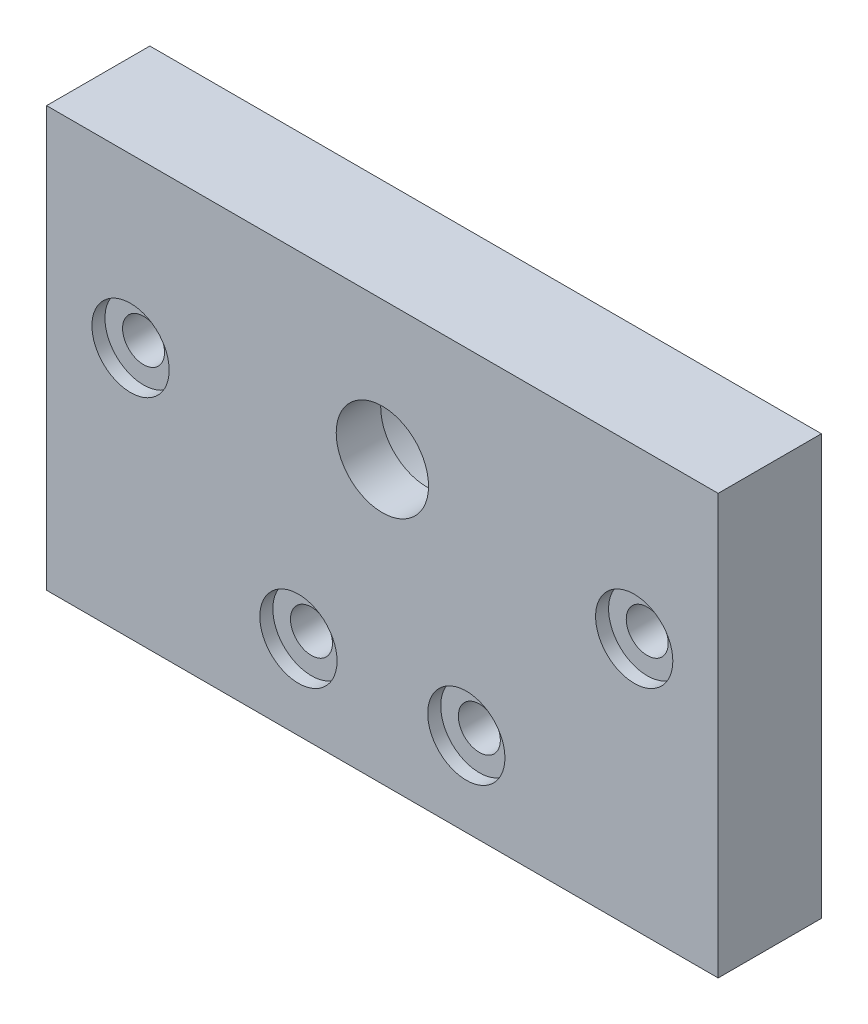
ISO-10303-21;
HEADER;
FILE_DESCRIPTION(('STEP AP214'),'2;1');
FILE_NAME('part.step','',(''),(''),'','','');
FILE_SCHEMA(('AUTOMOTIVE_DESIGN { 1 0 10303 214 1 1 1 1 }'));
ENDSEC;
DATA;
#1=APPLICATION_CONTEXT('core data for automotive mechanical design processes');
#2=APPLICATION_PROTOCOL_DEFINITION('international standard','automotive_design',2000,#1);
#3=PRODUCT_CONTEXT('',#1,'mechanical');
#4=PRODUCT('Part','Part','',(#3));
#5=PRODUCT_RELATED_PRODUCT_CATEGORY('part','',(#4));
#6=PRODUCT_DEFINITION_FORMATION('','',#4);
#7=PRODUCT_DEFINITION_CONTEXT('part definition',#1,'design');
#8=PRODUCT_DEFINITION('design','',#6,#7);
#9=PRODUCT_DEFINITION_SHAPE('','',#8);
#10=(LENGTH_UNIT() NAMED_UNIT(*) SI_UNIT(.MILLI.,.METRE.));
#11=(NAMED_UNIT(*) PLANE_ANGLE_UNIT() SI_UNIT($,.RADIAN.));
#12=(NAMED_UNIT(*) SI_UNIT($,.STERADIAN.) SOLID_ANGLE_UNIT());
#13=UNCERTAINTY_MEASURE_WITH_UNIT(LENGTH_MEASURE(1.E-05),#10,'distance_accuracy_value','');
#14=(GEOMETRIC_REPRESENTATION_CONTEXT(3) GLOBAL_UNCERTAINTY_ASSIGNED_CONTEXT((#13)) GLOBAL_UNIT_ASSIGNED_CONTEXT((#10,
#11,#12)) REPRESENTATION_CONTEXT('',''));
#15=CARTESIAN_POINT('',(0.,0.,0.));
#16=DIRECTION('',(0.,0.,1.));
#17=DIRECTION('',(1.,0.,0.));
#18=AXIS2_PLACEMENT_3D('',#15,#16,#17);
#19=CARTESIAN_POINT('',(40.,33.5,12.3));
#20=DIRECTION('',(0.,0.,-1.));
#21=DIRECTION('',(-1.,0.,0.));
#22=AXIS2_PLACEMENT_3D('',#19,#20,#21);
#23=CYLINDRICAL_SURFACE('',#22,5.5);
#24=CARTESIAN_POINT('',(40.,33.5,12.3));
#25=DIRECTION('',(0.,0.,1.));
#26=DIRECTION('',(1.,0.,0.));
#27=AXIS2_PLACEMENT_3D('',#24,#25,#26);
#28=CIRCLE('',#27,5.5);
#29=CARTESIAN_POINT('',(45.5,33.5,12.3));
#30=VERTEX_POINT('',#29);
#31=EDGE_CURVE('E104',#30,#30,#28,.T.);
#32=ORIENTED_EDGE('',*,*,#31,.T.);
#33=EDGE_LOOP('',(#32));
#34=FACE_BOUND('',#33,.T.);
#35=CARTESIAN_POINT('',(40.,33.5,7.));
#36=DIRECTION('',(0.,0.,-1.));
#37=DIRECTION('',(-1.,0.,0.));
#38=AXIS2_PLACEMENT_3D('',#35,#36,#37);
#39=CIRCLE('',#38,5.5);
#40=CARTESIAN_POINT('',(34.5,33.5,7.));
#41=VERTEX_POINT('',#40);
#42=EDGE_CURVE('E37',#41,#41,#39,.T.);
#43=ORIENTED_EDGE('',*,*,#42,.T.);
#44=EDGE_LOOP('',(#43));
#45=FACE_BOUND('',#44,.T.);
#46=ADVANCED_FACE('F33',(#34,#45),#23,.F.);
#47=CARTESIAN_POINT('',(30.,10.,12.3));
#48=DIRECTION('',(0.,0.,-1.));
#49=DIRECTION('',(-1.,0.,0.));
#50=AXIS2_PLACEMENT_3D('',#47,#48,#49);
#51=CYLINDRICAL_SURFACE('',#50,2.5);
#52=CARTESIAN_POINT('',(30.,10.,0.));
#53=DIRECTION('',(0.,0.,1.));
#54=DIRECTION('',(1.,0.,0.));
#55=AXIS2_PLACEMENT_3D('',#52,#53,#54);
#56=CIRCLE('',#55,2.5);
#57=CARTESIAN_POINT('',(32.5,10.,0.));
#58=VERTEX_POINT('',#57);
#59=EDGE_CURVE('E155',#58,#58,#56,.T.);
#60=ORIENTED_EDGE('',*,*,#59,.F.);
#61=EDGE_LOOP('',(#60));
#62=FACE_BOUND('',#61,.T.);
#63=CARTESIAN_POINT('',(30.,10.,10.75));
#64=DIRECTION('',(0.,0.,1.));
#65=DIRECTION('',(1.,0.,0.));
#66=AXIS2_PLACEMENT_3D('',#63,#64,#65);
#67=CIRCLE('',#66,2.5);
#68=CARTESIAN_POINT('',(32.5,10.,10.75));
#69=VERTEX_POINT('',#68);
#70=EDGE_CURVE('E120',#69,#69,#67,.T.);
#71=ORIENTED_EDGE('',*,*,#70,.T.);
#72=EDGE_LOOP('',(#71));
#73=FACE_BOUND('',#72,.T.);
#74=ADVANCED_FACE('F179',(#62,#73),#51,.F.);
#75=CARTESIAN_POINT('',(10.,30.,12.3));
#76=DIRECTION('',(0.,0.,-1.));
#77=DIRECTION('',(-1.,0.,0.));
#78=AXIS2_PLACEMENT_3D('',#75,#76,#77);
#79=CYLINDRICAL_SURFACE('',#78,2.5);
#80=CARTESIAN_POINT('',(10.,30.,0.));
#81=DIRECTION('',(0.,0.,1.));
#82=DIRECTION('',(1.,0.,0.));
#83=AXIS2_PLACEMENT_3D('',#80,#81,#82);
#84=CIRCLE('',#83,2.5);
#85=CARTESIAN_POINT('',(12.5,30.,0.));
#86=VERTEX_POINT('',#85);
#87=EDGE_CURVE('E161',#86,#86,#84,.T.);
#88=ORIENTED_EDGE('',*,*,#87,.F.);
#89=EDGE_LOOP('',(#88));
#90=FACE_BOUND('',#89,.T.);
#91=CARTESIAN_POINT('',(10.,30.,10.75));
#92=DIRECTION('',(0.,0.,1.));
#93=DIRECTION('',(1.,0.,0.));
#94=AXIS2_PLACEMENT_3D('',#91,#92,#93);
#95=CIRCLE('',#94,2.5);
#96=CARTESIAN_POINT('',(12.5,30.,10.75));
#97=VERTEX_POINT('',#96);
#98=EDGE_CURVE('E110',#97,#97,#95,.T.);
#99=ORIENTED_EDGE('',*,*,#98,.T.);
#100=EDGE_LOOP('',(#99));
#101=FACE_BOUND('',#100,.T.);
#102=ADVANCED_FACE('F170',(#90,#101),#79,.F.);
#103=CARTESIAN_POINT('',(0.,0.,12.3));
#104=DIRECTION('',(0.,0.,-1.));
#105=DIRECTION('',(-1.,0.,0.));
#106=AXIS2_PLACEMENT_3D('',#103,#104,#105);
#107=PLANE('',#106);
#108=CARTESIAN_POINT('',(50.,10.,12.3));
#109=DIRECTION('',(0.,0.,1.));
#110=DIRECTION('',(-1.,0.,0.));
#111=AXIS2_PLACEMENT_3D('',#108,#109,#110);
#112=CIRCLE('',#111,4.6);
#113=CARTESIAN_POINT('',(54.6,10.,12.3));
#114=VERTEX_POINT('',#113);
#115=EDGE_CURVE('E133',#114,#114,#112,.T.);
#116=ORIENTED_EDGE('',*,*,#115,.F.);
#117=EDGE_LOOP('',(#116));
#118=FACE_BOUND('',#117,.T.);
#119=CARTESIAN_POINT('',(30.,10.,12.3));
#120=DIRECTION('',(0.,0.,1.));
#121=DIRECTION('',(1.,0.,0.));
#122=AXIS2_PLACEMENT_3D('',#119,#120,#121);
#123=CIRCLE('',#122,4.6);
#124=CARTESIAN_POINT('',(34.6,10.,12.3));
#125=VERTEX_POINT('',#124);
#126=EDGE_CURVE('E126',#125,#125,#123,.T.);
#127=ORIENTED_EDGE('',*,*,#126,.F.);
#128=EDGE_LOOP('',(#127));
#129=FACE_BOUND('',#128,.T.);
#130=CARTESIAN_POINT('',(70.,30.,12.3));
#131=DIRECTION('',(0.,0.,1.));
#132=DIRECTION('',(-1.,0.,0.));
#133=AXIS2_PLACEMENT_3D('',#130,#131,#132);
#134=CIRCLE('',#133,4.60000000000001);
#135=CARTESIAN_POINT('',(74.6,30.,12.3));
#136=VERTEX_POINT('',#135);
#137=EDGE_CURVE('E122',#136,#136,#134,.T.);
#138=ORIENTED_EDGE('',*,*,#137,.F.);
#139=EDGE_LOOP('',(#138));
#140=FACE_BOUND('',#139,.T.);
#141=CARTESIAN_POINT('',(10.,30.,12.3));
#142=DIRECTION('',(0.,0.,1.));
#143=DIRECTION('',(1.,0.,0.));
#144=AXIS2_PLACEMENT_3D('',#141,#142,#143);
#145=CIRCLE('',#144,4.6);
#146=CARTESIAN_POINT('',(14.6,30.,12.3));
#147=VERTEX_POINT('',#146);
#148=EDGE_CURVE('E118',#147,#147,#145,.T.);
#149=ORIENTED_EDGE('',*,*,#148,.F.);
#150=EDGE_LOOP('',(#149));
#151=FACE_BOUND('',#150,.T.);
#152=DIRECTION('',(0.,-1.,0.));
#153=VECTOR('',#152,1.);
#154=CARTESIAN_POINT('',(0.,0.,12.3));
#155=LINE('',#154,#153);
#156=CARTESIAN_POINT('',(0.,50.,12.3));
#157=VERTEX_POINT('',#156);
#158=CARTESIAN_POINT('',(0.,0.,12.3));
#159=VERTEX_POINT('',#158);
#160=EDGE_CURVE('E88',#157,#159,#155,.T.);
#161=ORIENTED_EDGE('',*,*,#160,.T.);
#162=DIRECTION('',(1.,0.,0.));
#163=VECTOR('',#162,1.);
#164=CARTESIAN_POINT('',(0.,0.,12.3));
#165=LINE('',#164,#163);
#166=CARTESIAN_POINT('',(80.,0.,12.3));
#167=VERTEX_POINT('',#166);
#168=EDGE_CURVE('E82',#159,#167,#165,.T.);
#169=ORIENTED_EDGE('',*,*,#168,.T.);
#170=DIRECTION('',(0.,1.,0.));
#171=VECTOR('',#170,1.);
#172=CARTESIAN_POINT('',(80.,0.,12.3));
#173=LINE('',#172,#171);
#174=CARTESIAN_POINT('',(80.,50.,12.3));
#175=VERTEX_POINT('',#174);
#176=EDGE_CURVE('E86',#167,#175,#173,.T.);
#177=ORIENTED_EDGE('',*,*,#176,.T.);
#178=DIRECTION('',(-1.,0.,0.));
#179=VECTOR('',#178,1.);
#180=CARTESIAN_POINT('',(0.,50.,12.3));
#181=LINE('',#180,#179);
#182=EDGE_CURVE('E52',#175,#157,#181,.T.);
#183=ORIENTED_EDGE('',*,*,#182,.T.);
#184=EDGE_LOOP('',(#161,#169,#177,#183));
#185=FACE_BOUND('',#184,.T.);
#186=ORIENTED_EDGE('',*,*,#31,.F.);
#187=EDGE_LOOP('',(#186));
#188=FACE_BOUND('',#187,.T.);
#189=ADVANCED_FACE('F83',(#118,#129,#140,#151,#185,#188),#107,.F.);
#190=CARTESIAN_POINT('',(0.,0.,0.));
#191=DIRECTION('',(0.,0.,-1.));
#192=DIRECTION('',(-1.,0.,0.));
#193=AXIS2_PLACEMENT_3D('',#190,#191,#192);
#194=PLANE('',#193);
#195=CARTESIAN_POINT('',(40.,33.5,0.));
#196=DIRECTION('',(0.,0.,-1.));
#197=DIRECTION('',(-1.,0.,0.));
#198=AXIS2_PLACEMENT_3D('',#195,#196,#197);
#199=CIRCLE('',#198,11.);
#200=CARTESIAN_POINT('',(29.,33.5,0.));
#201=VERTEX_POINT('',#200);
#202=EDGE_CURVE('E140',#201,#201,#199,.T.);
#203=ORIENTED_EDGE('',*,*,#202,.F.);
#204=EDGE_LOOP('',(#203));
#205=FACE_BOUND('',#204,.T.);
#206=ORIENTED_EDGE('',*,*,#59,.T.);
#207=EDGE_LOOP('',(#206));
#208=FACE_BOUND('',#207,.T.);
#209=ORIENTED_EDGE('',*,*,#87,.T.);
#210=EDGE_LOOP('',(#209));
#211=FACE_BOUND('',#210,.T.);
#212=DIRECTION('',(0.,-1.,0.));
#213=VECTOR('',#212,1.);
#214=CARTESIAN_POINT('',(0.,0.,0.));
#215=LINE('',#214,#213);
#216=CARTESIAN_POINT('',(0.,50.,0.));
#217=VERTEX_POINT('',#216);
#218=CARTESIAN_POINT('',(0.,0.,0.));
#219=VERTEX_POINT('',#218);
#220=EDGE_CURVE('E101',#217,#219,#215,.T.);
#221=ORIENTED_EDGE('',*,*,#220,.F.);
#222=DIRECTION('',(-1.,0.,0.));
#223=VECTOR('',#222,1.);
#224=CARTESIAN_POINT('',(0.,50.,0.));
#225=LINE('',#224,#223);
#226=CARTESIAN_POINT('',(80.,50.,0.));
#227=VERTEX_POINT('',#226);
#228=EDGE_CURVE('E75',#227,#217,#225,.T.);
#229=ORIENTED_EDGE('',*,*,#228,.F.);
#230=DIRECTION('',(0.,1.,0.));
#231=VECTOR('',#230,1.);
#232=CARTESIAN_POINT('',(80.,0.,0.));
#233=LINE('',#232,#231);
#234=CARTESIAN_POINT('',(80.,0.,0.));
#235=VERTEX_POINT('',#234);
#236=EDGE_CURVE('E69',#235,#227,#233,.T.);
#237=ORIENTED_EDGE('',*,*,#236,.F.);
#238=DIRECTION('',(1.,0.,0.));
#239=VECTOR('',#238,1.);
#240=CARTESIAN_POINT('',(0.,0.,0.));
#241=LINE('',#240,#239);
#242=EDGE_CURVE('E92',#219,#235,#241,.T.);
#243=ORIENTED_EDGE('',*,*,#242,.F.);
#244=EDGE_LOOP('',(#221,#229,#237,#243));
#245=FACE_BOUND('',#244,.T.);
#246=CARTESIAN_POINT('',(70.,30.,0.));
#247=DIRECTION('',(0.,0.,1.));
#248=DIRECTION('',(-1.,0.,0.));
#249=AXIS2_PLACEMENT_3D('',#246,#247,#248);
#250=CIRCLE('',#249,2.50000000000001);
#251=CARTESIAN_POINT('',(67.5,30.,0.));
#252=VERTEX_POINT('',#251);
#253=EDGE_CURVE('E158',#252,#252,#250,.T.);
#254=ORIENTED_EDGE('',*,*,#253,.T.);
#255=EDGE_LOOP('',(#254));
#256=FACE_BOUND('',#255,.T.);
#257=CARTESIAN_POINT('',(50.,10.,0.));
#258=DIRECTION('',(0.,0.,1.));
#259=DIRECTION('',(-1.,0.,0.));
#260=AXIS2_PLACEMENT_3D('',#257,#258,#259);
#261=CIRCLE('',#260,2.5);
#262=CARTESIAN_POINT('',(47.5,10.,0.));
#263=VERTEX_POINT('',#262);
#264=EDGE_CURVE('E113',#263,#263,#261,.T.);
#265=ORIENTED_EDGE('',*,*,#264,.T.);
#266=EDGE_LOOP('',(#265));
#267=FACE_BOUND('',#266,.T.);
#268=ADVANCED_FACE('F169',(#205,#208,#211,#245,#256,#267),#194,.T.);
#269=CARTESIAN_POINT('',(0.,0.,12.3));
#270=DIRECTION('',(1.,0.,0.));
#271=DIRECTION('',(0.,0.,-1.));
#272=AXIS2_PLACEMENT_3D('',#269,#270,#271);
#273=PLANE('',#272);
#274=ORIENTED_EDGE('',*,*,#220,.T.);
#275=DIRECTION('',(0.,0.,-1.));
#276=VECTOR('',#275,1.);
#277=CARTESIAN_POINT('',(0.,0.,12.3));
#278=LINE('',#277,#276);
#279=EDGE_CURVE('E11',#159,#219,#278,.T.);
#280=ORIENTED_EDGE('',*,*,#279,.F.);
#281=ORIENTED_EDGE('',*,*,#160,.F.);
#282=DIRECTION('',(0.,0.,-1.));
#283=VECTOR('',#282,1.);
#284=CARTESIAN_POINT('',(0.,50.,12.3));
#285=LINE('',#284,#283);
#286=EDGE_CURVE('E97',#157,#217,#285,.T.);
#287=ORIENTED_EDGE('',*,*,#286,.T.);
#288=EDGE_LOOP('',(#274,#280,#281,#287));
#289=FACE_BOUND('',#288,.T.);
#290=ADVANCED_FACE('F35',(#289),#273,.F.);
#291=CARTESIAN_POINT('',(0.,0.,12.3));
#292=DIRECTION('',(0.,1.,0.));
#293=DIRECTION('',(0.,0.,1.));
#294=AXIS2_PLACEMENT_3D('',#291,#292,#293);
#295=PLANE('',#294);
#296=ORIENTED_EDGE('',*,*,#242,.T.);
#297=DIRECTION('',(0.,0.,-1.));
#298=VECTOR('',#297,1.);
#299=CARTESIAN_POINT('',(80.,0.,12.3));
#300=LINE('',#299,#298);
#301=EDGE_CURVE('E43',#167,#235,#300,.T.);
#302=ORIENTED_EDGE('',*,*,#301,.F.);
#303=ORIENTED_EDGE('',*,*,#168,.F.);
#304=ORIENTED_EDGE('',*,*,#279,.T.);
#305=EDGE_LOOP('',(#296,#302,#303,#304));
#306=FACE_BOUND('',#305,.T.);
#307=ADVANCED_FACE('F91',(#306),#295,.F.);
#308=CARTESIAN_POINT('',(80.,0.,12.3));
#309=DIRECTION('',(-1.,0.,0.));
#310=DIRECTION('',(0.,0.,1.));
#311=AXIS2_PLACEMENT_3D('',#308,#309,#310);
#312=PLANE('',#311);
#313=ORIENTED_EDGE('',*,*,#236,.T.);
#314=DIRECTION('',(0.,0.,-1.));
#315=VECTOR('',#314,1.);
#316=CARTESIAN_POINT('',(80.,50.,12.3));
#317=LINE('',#316,#315);
#318=EDGE_CURVE('E93',#175,#227,#317,.T.);
#319=ORIENTED_EDGE('',*,*,#318,.F.);
#320=ORIENTED_EDGE('',*,*,#176,.F.);
#321=ORIENTED_EDGE('',*,*,#301,.T.);
#322=EDGE_LOOP('',(#313,#319,#320,#321));
#323=FACE_BOUND('',#322,.T.);
#324=ADVANCED_FACE('F95',(#323),#312,.F.);
#325=CARTESIAN_POINT('',(0.,50.,12.3));
#326=DIRECTION('',(0.,-1.,0.));
#327=DIRECTION('',(0.,0.,-1.));
#328=AXIS2_PLACEMENT_3D('',#325,#326,#327);
#329=PLANE('',#328);
#330=ORIENTED_EDGE('',*,*,#228,.T.);
#331=ORIENTED_EDGE('',*,*,#286,.F.);
#332=ORIENTED_EDGE('',*,*,#182,.F.);
#333=ORIENTED_EDGE('',*,*,#318,.T.);
#334=EDGE_LOOP('',(#330,#331,#332,#333));
#335=FACE_BOUND('',#334,.T.);
#336=ADVANCED_FACE('F195',(#335),#329,.F.);
#337=CARTESIAN_POINT('',(70.,30.,12.3));
#338=DIRECTION('',(0.,0.,-1.));
#339=DIRECTION('',(-1.,0.,0.));
#340=AXIS2_PLACEMENT_3D('',#337,#338,#339);
#341=CYLINDRICAL_SURFACE('',#340,2.50000000000001);
#342=CARTESIAN_POINT('',(70.,30.,10.75));
#343=DIRECTION('',(0.,0.,-1.));
#344=DIRECTION('',(-1.,0.,0.));
#345=AXIS2_PLACEMENT_3D('',#342,#343,#344);
#346=CIRCLE('',#345,2.50000000000001);
#347=CARTESIAN_POINT('',(67.5,30.,10.75));
#348=VERTEX_POINT('',#347);
#349=EDGE_CURVE('E115',#348,#348,#346,.T.);
#350=ORIENTED_EDGE('',*,*,#349,.F.);
#351=EDGE_LOOP('',(#350));
#352=FACE_BOUND('',#351,.T.);
#353=ORIENTED_EDGE('',*,*,#253,.F.);
#354=EDGE_LOOP('',(#353));
#355=FACE_BOUND('',#354,.T.);
#356=ADVANCED_FACE('F192',(#352,#355),#341,.F.);
#357=CARTESIAN_POINT('',(50.,10.,12.3));
#358=DIRECTION('',(0.,0.,-1.));
#359=DIRECTION('',(-1.,0.,0.));
#360=AXIS2_PLACEMENT_3D('',#357,#358,#359);
#361=CYLINDRICAL_SURFACE('',#360,2.5);
#362=CARTESIAN_POINT('',(50.,10.,10.75));
#363=DIRECTION('',(0.,0.,-1.));
#364=DIRECTION('',(-1.,0.,0.));
#365=AXIS2_PLACEMENT_3D('',#362,#363,#364);
#366=CIRCLE('',#365,2.5);
#367=CARTESIAN_POINT('',(47.5,10.,10.75));
#368=VERTEX_POINT('',#367);
#369=EDGE_CURVE('E124',#368,#368,#366,.T.);
#370=ORIENTED_EDGE('',*,*,#369,.F.);
#371=EDGE_LOOP('',(#370));
#372=FACE_BOUND('',#371,.T.);
#373=ORIENTED_EDGE('',*,*,#264,.F.);
#374=EDGE_LOOP('',(#373));
#375=FACE_BOUND('',#374,.T.);
#376=ADVANCED_FACE('F194',(#372,#375),#361,.F.);
#377=CARTESIAN_POINT('',(10.,30.,10.75));
#378=DIRECTION('',(0.,0.,1.));
#379=DIRECTION('',(1.,0.,0.));
#380=AXIS2_PLACEMENT_3D('',#377,#378,#379);
#381=CYLINDRICAL_SURFACE('',#380,4.6);
#382=CARTESIAN_POINT('',(10.,30.,10.75));
#383=DIRECTION('',(0.,0.,1.));
#384=DIRECTION('',(1.,0.,0.));
#385=AXIS2_PLACEMENT_3D('',#382,#383,#384);
#386=CIRCLE('',#385,4.6);
#387=CARTESIAN_POINT('',(14.6,30.,10.75));
#388=VERTEX_POINT('',#387);
#389=EDGE_CURVE('E114',#388,#388,#386,.T.);
#390=CARTESIAN_POINT('',(14.6,30.,10.75));
#391=CARTESIAN_POINT('',(14.6,30.,10.7661458333333));
#392=CARTESIAN_POINT('',(14.6,30.,10.7822916666667));
#393=CARTESIAN_POINT('',(14.6,30.,10.8145833333333));
#394=CARTESIAN_POINT('',(14.6,30.,10.8307291666667));
#395=CARTESIAN_POINT('',(14.6,30.,10.8630208333333));
#396=CARTESIAN_POINT('',(14.6,30.,10.8791666666667));
#397=CARTESIAN_POINT('',(14.6,30.,10.9114583333333));
#398=CARTESIAN_POINT('',(14.6,30.,10.9276041666667));
#399=CARTESIAN_POINT('',(14.6,30.,10.9598958333333));
#400=CARTESIAN_POINT('',(14.6,30.,10.9760416666667));
#401=CARTESIAN_POINT('',(14.6,30.,11.0083333333333));
#402=CARTESIAN_POINT('',(14.6,30.,11.0244791666667));
#403=CARTESIAN_POINT('',(14.6,30.,11.0567708333333));
#404=CARTESIAN_POINT('',(14.6,30.,11.0729166666667));
#405=CARTESIAN_POINT('',(14.6,30.,11.1052083333333));
#406=CARTESIAN_POINT('',(14.6,30.,11.1213541666667));
#407=CARTESIAN_POINT('',(14.6,30.,11.1536458333333));
#408=CARTESIAN_POINT('',(14.6,30.,11.1697916666667));
#409=CARTESIAN_POINT('',(14.6,30.,11.2020833333333));
#410=CARTESIAN_POINT('',(14.6,30.,11.2182291666667));
#411=CARTESIAN_POINT('',(14.6,30.,11.2505208333333));
#412=CARTESIAN_POINT('',(14.6,30.,11.2666666666667));
#413=CARTESIAN_POINT('',(14.6,30.,11.2989583333333));
#414=CARTESIAN_POINT('',(14.6,30.,11.3151041666667));
#415=CARTESIAN_POINT('',(14.6,30.,11.3473958333333));
#416=CARTESIAN_POINT('',(14.6,30.,11.3635416666667));
#417=CARTESIAN_POINT('',(14.6,30.,11.3958333333333));
#418=CARTESIAN_POINT('',(14.6,30.,11.4119791666667));
#419=CARTESIAN_POINT('',(14.6,30.,11.4442708333333));
#420=CARTESIAN_POINT('',(14.6,30.,11.4604166666667));
#421=CARTESIAN_POINT('',(14.6,30.,11.4927083333333));
#422=CARTESIAN_POINT('',(14.6,30.,11.5088541666667));
#423=CARTESIAN_POINT('',(14.6,30.,11.5411458333333));
#424=CARTESIAN_POINT('',(14.6,30.,11.5572916666667));
#425=CARTESIAN_POINT('',(14.6,30.,11.5895833333333));
#426=CARTESIAN_POINT('',(14.6,30.,11.6057291666667));
#427=CARTESIAN_POINT('',(14.6,30.,11.6380208333333));
#428=CARTESIAN_POINT('',(14.6,30.,11.6541666666667));
#429=CARTESIAN_POINT('',(14.6,30.,11.6864583333333));
#430=CARTESIAN_POINT('',(14.6,30.,11.7026041666667));
#431=CARTESIAN_POINT('',(14.6,30.,11.7348958333333));
#432=CARTESIAN_POINT('',(14.6,30.,11.7510416666667));
#433=CARTESIAN_POINT('',(14.6,30.,11.7833333333333));
#434=CARTESIAN_POINT('',(14.6,30.,11.7994791666667));
#435=CARTESIAN_POINT('',(14.6,30.,11.8317708333333));
#436=CARTESIAN_POINT('',(14.6,30.,11.8479166666667));
#437=CARTESIAN_POINT('',(14.6,30.,11.8802083333333));
#438=CARTESIAN_POINT('',(14.6,30.,11.8963541666667));
#439=CARTESIAN_POINT('',(14.6,30.,11.9286458333333));
#440=CARTESIAN_POINT('',(14.6,30.,11.9447916666667));
#441=CARTESIAN_POINT('',(14.6,30.,11.9770833333333));
#442=CARTESIAN_POINT('',(14.6,30.,11.9932291666667));
#443=CARTESIAN_POINT('',(14.6,30.,12.0255208333333));
#444=CARTESIAN_POINT('',(14.6,30.,12.0416666666667));
#445=CARTESIAN_POINT('',(14.6,30.,12.0739583333333));
#446=CARTESIAN_POINT('',(14.6,30.,12.0901041666667));
#447=CARTESIAN_POINT('',(14.6,30.,12.1223958333333));
#448=CARTESIAN_POINT('',(14.6,30.,12.1385416666667));
#449=CARTESIAN_POINT('',(14.6,30.,12.1708333333333));
#450=CARTESIAN_POINT('',(14.6,30.,12.1869791666667));
#451=CARTESIAN_POINT('',(14.6,30.,12.2192708333333));
#452=CARTESIAN_POINT('',(14.6,30.,12.2354166666667));
#453=CARTESIAN_POINT('',(14.6,30.,12.2677083333333));
#454=CARTESIAN_POINT('',(14.6,30.,12.2838541666667));
#455=CARTESIAN_POINT('',(14.6,30.,12.3));
#456=B_SPLINE_CURVE_WITH_KNOTS('',3,(#390,#391,#392,#393,#394,#395,#396,#397,#398,#399,#400,
#401,#402,#403,#404,#405,#406,#407,#408,#409,#410,#411,#412,#413,#414,#415,#416,#417,#418,#419,
#420,#421,#422,#423,#424,#425,#426,#427,#428,#429,#430,#431,#432,#433,#434,#435,#436,#437,#438,
#439,#440,#441,#442,#443,#444,#445,#446,#447,#448,#449,#450,#451,#452,#453,#454,#455),
.UNSPECIFIED.,.F.,.F.,(4,2,2,2,2,2,2,2,2,2,2,2,2,2,2,2,2,2,2,2,2,2,2,2,2,2,2,2,2,2,2,2,4),(0.,
0.0484374999999999,0.0968749999999997,0.1453125,0.193749999999999,0.242187499999999,
0.290624999999999,0.339062499999999,0.387499999999999,0.435937499999999,0.484374999999999,
0.532812499999999,0.581249999999998,0.629687499999998,0.678124999999998,0.726562499999998,0.775,
0.823437499999999,0.871874999999999,0.920312499999999,0.968749999999999,1.0171875,1.065625,
1.1140625,1.1625,1.2109375,1.259375,1.3078125,1.35625,1.4046875,1.453125,1.5015625,1.55),.UNSPECIFIED.);
#457=EDGE_CURVE('BSEAM200',#388,#147,#456,.T.);
#458=ORIENTED_EDGE('',*,*,#389,.F.);
#459=ORIENTED_EDGE('',*,*,#148,.T.);
#460=ORIENTED_EDGE('',*,*,#457,.T.);
#461=ORIENTED_EDGE('',*,*,#457,.F.);
#462=EDGE_LOOP('',(#458,#460,#459,#461));
#463=FACE_BOUND('',#462,.T.);
#464=ADVANCED_FACE('F200',(#463),#381,.F.);
#465=CARTESIAN_POINT('',(10.,30.,10.75));
#466=DIRECTION('',(0.,0.,1.));
#467=DIRECTION('',(1.,0.,0.));
#468=AXIS2_PLACEMENT_3D('',#465,#466,#467);
#469=PLANE('',#468);
#470=ORIENTED_EDGE('',*,*,#98,.F.);
#471=EDGE_LOOP('',(#470));
#472=FACE_BOUND('',#471,.T.);
#473=ORIENTED_EDGE('',*,*,#389,.T.);
#474=EDGE_LOOP('',(#473));
#475=FACE_BOUND('',#474,.T.);
#476=ADVANCED_FACE('F204',(#472,#475),#469,.T.);
#477=CARTESIAN_POINT('',(70.,30.,10.75));
#478=DIRECTION('',(0.,0.,1.));
#479=DIRECTION('',(1.,0.,0.));
#480=AXIS2_PLACEMENT_3D('',#477,#478,#479);
#481=CYLINDRICAL_SURFACE('',#480,4.60000000000001);
#482=CARTESIAN_POINT('',(70.,30.,10.75));
#483=DIRECTION('',(0.,0.,1.));
#484=DIRECTION('',(-1.,0.,0.));
#485=AXIS2_PLACEMENT_3D('',#482,#483,#484);
#486=CIRCLE('',#485,4.60000000000001);
#487=CARTESIAN_POINT('',(74.6,30.,10.75));
#488=VERTEX_POINT('',#487);
#489=EDGE_CURVE('E119',#488,#488,#486,.T.);
#490=CARTESIAN_POINT('',(74.6,30.,10.75));
#491=CARTESIAN_POINT('',(74.6,30.,10.7661458333333));
#492=CARTESIAN_POINT('',(74.6,30.,10.7822916666667));
#493=CARTESIAN_POINT('',(74.6,30.,10.8145833333333));
#494=CARTESIAN_POINT('',(74.6,30.,10.8307291666667));
#495=CARTESIAN_POINT('',(74.6,30.,10.8630208333333));
#496=CARTESIAN_POINT('',(74.6,30.,10.8791666666667));
#497=CARTESIAN_POINT('',(74.6,30.,10.9114583333333));
#498=CARTESIAN_POINT('',(74.6,30.,10.9276041666667));
#499=CARTESIAN_POINT('',(74.6,30.,10.9598958333333));
#500=CARTESIAN_POINT('',(74.6,30.,10.9760416666667));
#501=CARTESIAN_POINT('',(74.6,30.,11.0083333333333));
#502=CARTESIAN_POINT('',(74.6,30.,11.0244791666667));
#503=CARTESIAN_POINT('',(74.6,30.,11.0567708333333));
#504=CARTESIAN_POINT('',(74.6,30.,11.0729166666667));
#505=CARTESIAN_POINT('',(74.6,30.,11.1052083333333));
#506=CARTESIAN_POINT('',(74.6,30.,11.1213541666667));
#507=CARTESIAN_POINT('',(74.6,30.,11.1536458333333));
#508=CARTESIAN_POINT('',(74.6,30.,11.1697916666667));
#509=CARTESIAN_POINT('',(74.6,30.,11.2020833333333));
#510=CARTESIAN_POINT('',(74.6,30.,11.2182291666667));
#511=CARTESIAN_POINT('',(74.6,30.,11.2505208333333));
#512=CARTESIAN_POINT('',(74.6,30.,11.2666666666667));
#513=CARTESIAN_POINT('',(74.6,30.,11.2989583333333));
#514=CARTESIAN_POINT('',(74.6,30.,11.3151041666667));
#515=CARTESIAN_POINT('',(74.6,30.,11.3473958333333));
#516=CARTESIAN_POINT('',(74.6,30.,11.3635416666667));
#517=CARTESIAN_POINT('',(74.6,30.,11.3958333333333));
#518=CARTESIAN_POINT('',(74.6,30.,11.4119791666667));
#519=CARTESIAN_POINT('',(74.6,30.,11.4442708333333));
#520=CARTESIAN_POINT('',(74.6,30.,11.4604166666667));
#521=CARTESIAN_POINT('',(74.6,30.,11.4927083333333));
#522=CARTESIAN_POINT('',(74.6,30.,11.5088541666667));
#523=CARTESIAN_POINT('',(74.6,30.,11.5411458333333));
#524=CARTESIAN_POINT('',(74.6,30.,11.5572916666667));
#525=CARTESIAN_POINT('',(74.6,30.,11.5895833333333));
#526=CARTESIAN_POINT('',(74.6,30.,11.6057291666667));
#527=CARTESIAN_POINT('',(74.6,30.,11.6380208333333));
#528=CARTESIAN_POINT('',(74.6,30.,11.6541666666667));
#529=CARTESIAN_POINT('',(74.6,30.,11.6864583333333));
#530=CARTESIAN_POINT('',(74.6,30.,11.7026041666667));
#531=CARTESIAN_POINT('',(74.6,30.,11.7348958333333));
#532=CARTESIAN_POINT('',(74.6,30.,11.7510416666667));
#533=CARTESIAN_POINT('',(74.6,30.,11.7833333333333));
#534=CARTESIAN_POINT('',(74.6,30.,11.7994791666667));
#535=CARTESIAN_POINT('',(74.6,30.,11.8317708333333));
#536=CARTESIAN_POINT('',(74.6,30.,11.8479166666667));
#537=CARTESIAN_POINT('',(74.6,30.,11.8802083333333));
#538=CARTESIAN_POINT('',(74.6,30.,11.8963541666667));
#539=CARTESIAN_POINT('',(74.6,30.,11.9286458333333));
#540=CARTESIAN_POINT('',(74.6,30.,11.9447916666667));
#541=CARTESIAN_POINT('',(74.6,30.,11.9770833333333));
#542=CARTESIAN_POINT('',(74.6,30.,11.9932291666667));
#543=CARTESIAN_POINT('',(74.6,30.,12.0255208333333));
#544=CARTESIAN_POINT('',(74.6,30.,12.0416666666667));
#545=CARTESIAN_POINT('',(74.6,30.,12.0739583333333));
#546=CARTESIAN_POINT('',(74.6,30.,12.0901041666667));
#547=CARTESIAN_POINT('',(74.6,30.,12.1223958333333));
#548=CARTESIAN_POINT('',(74.6,30.,12.1385416666667));
#549=CARTESIAN_POINT('',(74.6,30.,12.1708333333333));
#550=CARTESIAN_POINT('',(74.6,30.,12.1869791666667));
#551=CARTESIAN_POINT('',(74.6,30.,12.2192708333333));
#552=CARTESIAN_POINT('',(74.6,30.,12.2354166666667));
#553=CARTESIAN_POINT('',(74.6,30.,12.2677083333333));
#554=CARTESIAN_POINT('',(74.6,30.,12.2838541666667));
#555=CARTESIAN_POINT('',(74.6,30.,12.3));
#556=B_SPLINE_CURVE_WITH_KNOTS('',3,(#490,#491,#492,#493,#494,#495,#496,#497,#498,#499,#500,
#501,#502,#503,#504,#505,#506,#507,#508,#509,#510,#511,#512,#513,#514,#515,#516,#517,#518,#519,
#520,#521,#522,#523,#524,#525,#526,#527,#528,#529,#530,#531,#532,#533,#534,#535,#536,#537,#538,
#539,#540,#541,#542,#543,#544,#545,#546,#547,#548,#549,#550,#551,#552,#553,#554,#555),
.UNSPECIFIED.,.F.,.F.,(4,2,2,2,2,2,2,2,2,2,2,2,2,2,2,2,2,2,2,2,2,2,2,2,2,2,2,2,2,2,2,2,4),(0.,
0.0484374999999999,0.0968749999999997,0.1453125,0.193749999999999,0.242187499999999,
0.290624999999999,0.339062499999999,0.387499999999999,0.435937499999999,0.484374999999999,
0.532812499999999,0.581249999999998,0.629687499999998,0.678124999999998,0.726562499999998,0.775,
0.823437499999999,0.871874999999999,0.920312499999999,0.968749999999999,1.0171875,1.065625,
1.1140625,1.1625,1.2109375,1.259375,1.3078125,1.35625,1.4046875,1.453125,1.5015625,1.55),.UNSPECIFIED.);
#557=EDGE_CURVE('BSEAM208',#488,#136,#556,.T.);
#558=ORIENTED_EDGE('',*,*,#489,.F.);
#559=ORIENTED_EDGE('',*,*,#137,.T.);
#560=ORIENTED_EDGE('',*,*,#557,.T.);
#561=ORIENTED_EDGE('',*,*,#557,.F.);
#562=EDGE_LOOP('',(#558,#560,#559,#561));
#563=FACE_BOUND('',#562,.T.);
#564=ADVANCED_FACE('F208',(#563),#481,.F.);
#565=CARTESIAN_POINT('',(70.,30.,10.75));
#566=DIRECTION('',(0.,0.,-1.));
#567=DIRECTION('',(-1.,0.,0.));
#568=AXIS2_PLACEMENT_3D('',#565,#566,#567);
#569=PLANE('',#568);
#570=ORIENTED_EDGE('',*,*,#349,.T.);
#571=EDGE_LOOP('',(#570));
#572=FACE_BOUND('',#571,.T.);
#573=ORIENTED_EDGE('',*,*,#489,.T.);
#574=EDGE_LOOP('',(#573));
#575=FACE_BOUND('',#574,.T.);
#576=ADVANCED_FACE('F212',(#572,#575),#569,.F.);
#577=CARTESIAN_POINT('',(30.,10.,10.75));
#578=DIRECTION('',(0.,0.,1.));
#579=DIRECTION('',(1.,0.,0.));
#580=AXIS2_PLACEMENT_3D('',#577,#578,#579);
#581=CYLINDRICAL_SURFACE('',#580,4.6);
#582=CARTESIAN_POINT('',(30.,10.,10.75));
#583=DIRECTION('',(0.,0.,1.));
#584=DIRECTION('',(1.,0.,0.));
#585=AXIS2_PLACEMENT_3D('',#582,#583,#584);
#586=CIRCLE('',#585,4.6);
#587=CARTESIAN_POINT('',(34.6,10.,10.75));
#588=VERTEX_POINT('',#587);
#589=EDGE_CURVE('E123',#588,#588,#586,.T.);
#590=CARTESIAN_POINT('',(34.6,10.,10.75));
#591=CARTESIAN_POINT('',(34.6,10.,10.7661458333333));
#592=CARTESIAN_POINT('',(34.6,10.,10.7822916666667));
#593=CARTESIAN_POINT('',(34.6,10.,10.8145833333333));
#594=CARTESIAN_POINT('',(34.6,10.,10.8307291666667));
#595=CARTESIAN_POINT('',(34.6,10.,10.8630208333333));
#596=CARTESIAN_POINT('',(34.6,10.,10.8791666666667));
#597=CARTESIAN_POINT('',(34.6,10.,10.9114583333333));
#598=CARTESIAN_POINT('',(34.6,10.,10.9276041666667));
#599=CARTESIAN_POINT('',(34.6,10.,10.9598958333333));
#600=CARTESIAN_POINT('',(34.6,10.,10.9760416666667));
#601=CARTESIAN_POINT('',(34.6,10.,11.0083333333333));
#602=CARTESIAN_POINT('',(34.6,10.,11.0244791666667));
#603=CARTESIAN_POINT('',(34.6,10.,11.0567708333333));
#604=CARTESIAN_POINT('',(34.6,10.,11.0729166666667));
#605=CARTESIAN_POINT('',(34.6,10.,11.1052083333333));
#606=CARTESIAN_POINT('',(34.6,10.,11.1213541666667));
#607=CARTESIAN_POINT('',(34.6,10.,11.1536458333333));
#608=CARTESIAN_POINT('',(34.6,10.,11.1697916666667));
#609=CARTESIAN_POINT('',(34.6,10.,11.2020833333333));
#610=CARTESIAN_POINT('',(34.6,10.,11.2182291666667));
#611=CARTESIAN_POINT('',(34.6,10.,11.2505208333333));
#612=CARTESIAN_POINT('',(34.6,10.,11.2666666666667));
#613=CARTESIAN_POINT('',(34.6,10.,11.2989583333333));
#614=CARTESIAN_POINT('',(34.6,10.,11.3151041666667));
#615=CARTESIAN_POINT('',(34.6,10.,11.3473958333333));
#616=CARTESIAN_POINT('',(34.6,10.,11.3635416666667));
#617=CARTESIAN_POINT('',(34.6,10.,11.3958333333333));
#618=CARTESIAN_POINT('',(34.6,10.,11.4119791666667));
#619=CARTESIAN_POINT('',(34.6,10.,11.4442708333333));
#620=CARTESIAN_POINT('',(34.6,10.,11.4604166666667));
#621=CARTESIAN_POINT('',(34.6,10.,11.4927083333333));
#622=CARTESIAN_POINT('',(34.6,10.,11.5088541666667));
#623=CARTESIAN_POINT('',(34.6,10.,11.5411458333333));
#624=CARTESIAN_POINT('',(34.6,10.,11.5572916666667));
#625=CARTESIAN_POINT('',(34.6,10.,11.5895833333333));
#626=CARTESIAN_POINT('',(34.6,10.,11.6057291666667));
#627=CARTESIAN_POINT('',(34.6,10.,11.6380208333333));
#628=CARTESIAN_POINT('',(34.6,10.,11.6541666666667));
#629=CARTESIAN_POINT('',(34.6,10.,11.6864583333333));
#630=CARTESIAN_POINT('',(34.6,10.,11.7026041666667));
#631=CARTESIAN_POINT('',(34.6,10.,11.7348958333333));
#632=CARTESIAN_POINT('',(34.6,10.,11.7510416666667));
#633=CARTESIAN_POINT('',(34.6,10.,11.7833333333333));
#634=CARTESIAN_POINT('',(34.6,10.,11.7994791666667));
#635=CARTESIAN_POINT('',(34.6,10.,11.8317708333333));
#636=CARTESIAN_POINT('',(34.6,10.,11.8479166666667));
#637=CARTESIAN_POINT('',(34.6,10.,11.8802083333333));
#638=CARTESIAN_POINT('',(34.6,10.,11.8963541666667));
#639=CARTESIAN_POINT('',(34.6,10.,11.9286458333333));
#640=CARTESIAN_POINT('',(34.6,10.,11.9447916666667));
#641=CARTESIAN_POINT('',(34.6,10.,11.9770833333333));
#642=CARTESIAN_POINT('',(34.6,10.,11.9932291666667));
#643=CARTESIAN_POINT('',(34.6,10.,12.0255208333333));
#644=CARTESIAN_POINT('',(34.6,10.,12.0416666666667));
#645=CARTESIAN_POINT('',(34.6,10.,12.0739583333333));
#646=CARTESIAN_POINT('',(34.6,10.,12.0901041666667));
#647=CARTESIAN_POINT('',(34.6,10.,12.1223958333333));
#648=CARTESIAN_POINT('',(34.6,10.,12.1385416666667));
#649=CARTESIAN_POINT('',(34.6,10.,12.1708333333333));
#650=CARTESIAN_POINT('',(34.6,10.,12.1869791666667));
#651=CARTESIAN_POINT('',(34.6,10.,12.2192708333333));
#652=CARTESIAN_POINT('',(34.6,10.,12.2354166666667));
#653=CARTESIAN_POINT('',(34.6,10.,12.2677083333333));
#654=CARTESIAN_POINT('',(34.6,10.,12.2838541666667));
#655=CARTESIAN_POINT('',(34.6,10.,12.3));
#656=B_SPLINE_CURVE_WITH_KNOTS('',3,(#590,#591,#592,#593,#594,#595,#596,#597,#598,#599,#600,
#601,#602,#603,#604,#605,#606,#607,#608,#609,#610,#611,#612,#613,#614,#615,#616,#617,#618,#619,
#620,#621,#622,#623,#624,#625,#626,#627,#628,#629,#630,#631,#632,#633,#634,#635,#636,#637,#638,
#639,#640,#641,#642,#643,#644,#645,#646,#647,#648,#649,#650,#651,#652,#653,#654,#655),
.UNSPECIFIED.,.F.,.F.,(4,2,2,2,2,2,2,2,2,2,2,2,2,2,2,2,2,2,2,2,2,2,2,2,2,2,2,2,2,2,2,2,4),(0.,
0.0484374999999999,0.0968749999999997,0.1453125,0.193749999999999,0.242187499999999,
0.290624999999999,0.339062499999999,0.387499999999999,0.435937499999999,0.484374999999999,
0.532812499999999,0.581249999999998,0.629687499999998,0.678124999999998,0.726562499999998,0.775,
0.823437499999999,0.871874999999999,0.920312499999999,0.968749999999999,1.0171875,1.065625,
1.1140625,1.1625,1.2109375,1.259375,1.3078125,1.35625,1.4046875,1.453125,1.5015625,1.55),.UNSPECIFIED.);
#657=EDGE_CURVE('BSEAM216',#588,#125,#656,.T.);
#658=ORIENTED_EDGE('',*,*,#589,.F.);
#659=ORIENTED_EDGE('',*,*,#126,.T.);
#660=ORIENTED_EDGE('',*,*,#657,.T.);
#661=ORIENTED_EDGE('',*,*,#657,.F.);
#662=EDGE_LOOP('',(#658,#660,#659,#661));
#663=FACE_BOUND('',#662,.T.);
#664=ADVANCED_FACE('F216',(#663),#581,.F.);
#665=CARTESIAN_POINT('',(30.,10.,10.75));
#666=DIRECTION('',(0.,0.,1.));
#667=DIRECTION('',(1.,0.,0.));
#668=AXIS2_PLACEMENT_3D('',#665,#666,#667);
#669=PLANE('',#668);
#670=ORIENTED_EDGE('',*,*,#70,.F.);
#671=EDGE_LOOP('',(#670));
#672=FACE_BOUND('',#671,.T.);
#673=ORIENTED_EDGE('',*,*,#589,.T.);
#674=EDGE_LOOP('',(#673));
#675=FACE_BOUND('',#674,.T.);
#676=ADVANCED_FACE('F220',(#672,#675),#669,.T.);
#677=CARTESIAN_POINT('',(50.,10.,10.75));
#678=DIRECTION('',(0.,0.,1.));
#679=DIRECTION('',(1.,0.,0.));
#680=AXIS2_PLACEMENT_3D('',#677,#678,#679);
#681=CYLINDRICAL_SURFACE('',#680,4.6);
#682=CARTESIAN_POINT('',(50.,10.,10.75));
#683=DIRECTION('',(0.,0.,1.));
#684=DIRECTION('',(-1.,0.,0.));
#685=AXIS2_PLACEMENT_3D('',#682,#683,#684);
#686=CIRCLE('',#685,4.6);
#687=CARTESIAN_POINT('',(54.6,10.,10.75));
#688=VERTEX_POINT('',#687);
#689=EDGE_CURVE('E127',#688,#688,#686,.T.);
#690=CARTESIAN_POINT('',(54.6,10.,10.75));
#691=CARTESIAN_POINT('',(54.6,10.,10.7661458333333));
#692=CARTESIAN_POINT('',(54.6,10.,10.7822916666667));
#693=CARTESIAN_POINT('',(54.6,10.,10.8145833333333));
#694=CARTESIAN_POINT('',(54.6,10.,10.8307291666667));
#695=CARTESIAN_POINT('',(54.6,10.,10.8630208333333));
#696=CARTESIAN_POINT('',(54.6,10.,10.8791666666667));
#697=CARTESIAN_POINT('',(54.6,10.,10.9114583333333));
#698=CARTESIAN_POINT('',(54.6,10.,10.9276041666667));
#699=CARTESIAN_POINT('',(54.6,10.,10.9598958333333));
#700=CARTESIAN_POINT('',(54.6,10.,10.9760416666667));
#701=CARTESIAN_POINT('',(54.6,10.,11.0083333333333));
#702=CARTESIAN_POINT('',(54.6,10.,11.0244791666667));
#703=CARTESIAN_POINT('',(54.6,10.,11.0567708333333));
#704=CARTESIAN_POINT('',(54.6,10.,11.0729166666667));
#705=CARTESIAN_POINT('',(54.6,10.,11.1052083333333));
#706=CARTESIAN_POINT('',(54.6,10.,11.1213541666667));
#707=CARTESIAN_POINT('',(54.6,10.,11.1536458333333));
#708=CARTESIAN_POINT('',(54.6,10.,11.1697916666667));
#709=CARTESIAN_POINT('',(54.6,10.,11.2020833333333));
#710=CARTESIAN_POINT('',(54.6,10.,11.2182291666667));
#711=CARTESIAN_POINT('',(54.6,10.,11.2505208333333));
#712=CARTESIAN_POINT('',(54.6,10.,11.2666666666667));
#713=CARTESIAN_POINT('',(54.6,10.,11.2989583333333));
#714=CARTESIAN_POINT('',(54.6,10.,11.3151041666667));
#715=CARTESIAN_POINT('',(54.6,10.,11.3473958333333));
#716=CARTESIAN_POINT('',(54.6,10.,11.3635416666667));
#717=CARTESIAN_POINT('',(54.6,10.,11.3958333333333));
#718=CARTESIAN_POINT('',(54.6,10.,11.4119791666667));
#719=CARTESIAN_POINT('',(54.6,10.,11.4442708333333));
#720=CARTESIAN_POINT('',(54.6,10.,11.4604166666667));
#721=CARTESIAN_POINT('',(54.6,10.,11.4927083333333));
#722=CARTESIAN_POINT('',(54.6,10.,11.5088541666667));
#723=CARTESIAN_POINT('',(54.6,10.,11.5411458333333));
#724=CARTESIAN_POINT('',(54.6,10.,11.5572916666667));
#725=CARTESIAN_POINT('',(54.6,10.,11.5895833333333));
#726=CARTESIAN_POINT('',(54.6,10.,11.6057291666667));
#727=CARTESIAN_POINT('',(54.6,10.,11.6380208333333));
#728=CARTESIAN_POINT('',(54.6,10.,11.6541666666667));
#729=CARTESIAN_POINT('',(54.6,10.,11.6864583333333));
#730=CARTESIAN_POINT('',(54.6,10.,11.7026041666667));
#731=CARTESIAN_POINT('',(54.6,10.,11.7348958333333));
#732=CARTESIAN_POINT('',(54.6,10.,11.7510416666667));
#733=CARTESIAN_POINT('',(54.6,10.,11.7833333333333));
#734=CARTESIAN_POINT('',(54.6,10.,11.7994791666667));
#735=CARTESIAN_POINT('',(54.6,10.,11.8317708333333));
#736=CARTESIAN_POINT('',(54.6,10.,11.8479166666667));
#737=CARTESIAN_POINT('',(54.6,10.,11.8802083333333));
#738=CARTESIAN_POINT('',(54.6,10.,11.8963541666667));
#739=CARTESIAN_POINT('',(54.6,10.,11.9286458333333));
#740=CARTESIAN_POINT('',(54.6,10.,11.9447916666667));
#741=CARTESIAN_POINT('',(54.6,10.,11.9770833333333));
#742=CARTESIAN_POINT('',(54.6,10.,11.9932291666667));
#743=CARTESIAN_POINT('',(54.6,10.,12.0255208333333));
#744=CARTESIAN_POINT('',(54.6,10.,12.0416666666667));
#745=CARTESIAN_POINT('',(54.6,10.,12.0739583333333));
#746=CARTESIAN_POINT('',(54.6,10.,12.0901041666667));
#747=CARTESIAN_POINT('',(54.6,10.,12.1223958333333));
#748=CARTESIAN_POINT('',(54.6,10.,12.1385416666667));
#749=CARTESIAN_POINT('',(54.6,10.,12.1708333333333));
#750=CARTESIAN_POINT('',(54.6,10.,12.1869791666667));
#751=CARTESIAN_POINT('',(54.6,10.,12.2192708333333));
#752=CARTESIAN_POINT('',(54.6,10.,12.2354166666667));
#753=CARTESIAN_POINT('',(54.6,10.,12.2677083333333));
#754=CARTESIAN_POINT('',(54.6,10.,12.2838541666667));
#755=CARTESIAN_POINT('',(54.6,10.,12.3));
#756=B_SPLINE_CURVE_WITH_KNOTS('',3,(#690,#691,#692,#693,#694,#695,#696,#697,#698,#699,#700,
#701,#702,#703,#704,#705,#706,#707,#708,#709,#710,#711,#712,#713,#714,#715,#716,#717,#718,#719,
#720,#721,#722,#723,#724,#725,#726,#727,#728,#729,#730,#731,#732,#733,#734,#735,#736,#737,#738,
#739,#740,#741,#742,#743,#744,#745,#746,#747,#748,#749,#750,#751,#752,#753,#754,#755),
.UNSPECIFIED.,.F.,.F.,(4,2,2,2,2,2,2,2,2,2,2,2,2,2,2,2,2,2,2,2,2,2,2,2,2,2,2,2,2,2,2,2,4),(0.,
0.0484374999999999,0.0968749999999997,0.1453125,0.193749999999999,0.242187499999999,
0.290624999999999,0.339062499999999,0.387499999999999,0.435937499999999,0.484374999999999,
0.532812499999999,0.581249999999998,0.629687499999998,0.678124999999998,0.726562499999998,0.775,
0.823437499999999,0.871874999999999,0.920312499999999,0.968749999999999,1.0171875,1.065625,
1.1140625,1.1625,1.2109375,1.259375,1.3078125,1.35625,1.4046875,1.453125,1.5015625,1.55),.UNSPECIFIED.);
#757=EDGE_CURVE('BSEAM224',#688,#114,#756,.T.);
#758=ORIENTED_EDGE('',*,*,#689,.F.);
#759=ORIENTED_EDGE('',*,*,#115,.T.);
#760=ORIENTED_EDGE('',*,*,#757,.T.);
#761=ORIENTED_EDGE('',*,*,#757,.F.);
#762=EDGE_LOOP('',(#758,#760,#759,#761));
#763=FACE_BOUND('',#762,.T.);
#764=ADVANCED_FACE('F224',(#763),#681,.F.);
#765=CARTESIAN_POINT('',(50.,10.,10.75));
#766=DIRECTION('',(0.,0.,-1.));
#767=DIRECTION('',(-1.,0.,0.));
#768=AXIS2_PLACEMENT_3D('',#765,#766,#767);
#769=PLANE('',#768);
#770=ORIENTED_EDGE('',*,*,#369,.T.);
#771=EDGE_LOOP('',(#770));
#772=FACE_BOUND('',#771,.T.);
#773=ORIENTED_EDGE('',*,*,#689,.T.);
#774=EDGE_LOOP('',(#773));
#775=FACE_BOUND('',#774,.T.);
#776=ADVANCED_FACE('F228',(#772,#775),#769,.F.);
#777=CARTESIAN_POINT('',(40.,33.5,7.));
#778=DIRECTION('',(0.,0.,-1.));
#779=DIRECTION('',(-1.,0.,0.));
#780=AXIS2_PLACEMENT_3D('',#777,#778,#779);
#781=CYLINDRICAL_SURFACE('',#780,11.);
#782=CARTESIAN_POINT('',(40.,33.5,7.));
#783=DIRECTION('',(0.,0.,-1.));
#784=DIRECTION('',(-1.,0.,0.));
#785=AXIS2_PLACEMENT_3D('',#782,#783,#784);
#786=CIRCLE('',#785,11.);
#787=CARTESIAN_POINT('',(29.,33.5,7.));
#788=VERTEX_POINT('',#787);
#789=EDGE_CURVE('E246',#788,#788,#786,.T.);
#790=ORIENTED_EDGE('',*,*,#789,.F.);
#791=EDGE_LOOP('',(#790));
#792=FACE_BOUND('',#791,.T.);
#793=ORIENTED_EDGE('',*,*,#202,.T.);
#794=EDGE_LOOP('',(#793));
#795=FACE_BOUND('',#794,.T.);
#796=ADVANCED_FACE('F232',(#792,#795),#781,.F.);
#797=CARTESIAN_POINT('',(40.,33.5,7.));
#798=DIRECTION('',(0.,0.,-1.));
#799=DIRECTION('',(-1.,0.,0.));
#800=AXIS2_PLACEMENT_3D('',#797,#798,#799);
#801=PLANE('',#800);
#802=ORIENTED_EDGE('',*,*,#42,.F.);
#803=EDGE_LOOP('',(#802));
#804=FACE_BOUND('',#803,.T.);
#805=ORIENTED_EDGE('',*,*,#789,.T.);
#806=EDGE_LOOP('',(#805));
#807=FACE_BOUND('',#806,.T.);
#808=ADVANCED_FACE('F235',(#804,#807),#801,.T.);
#809=CLOSED_SHELL('',(#46,#74,#102,#189,#268,#290,#307,#324,#336,#356,#376,#464,#476,#564,#576,
#664,#676,#764,#776,#796,#808));
#810=MANIFOLD_SOLID_BREP('B2',#809);
#811=ADVANCED_BREP_SHAPE_REPRESENTATION('',(#18,#810),#14);
#812=SHAPE_DEFINITION_REPRESENTATION(#9,#811);
ENDSEC;
END-ISO-10303-21;
